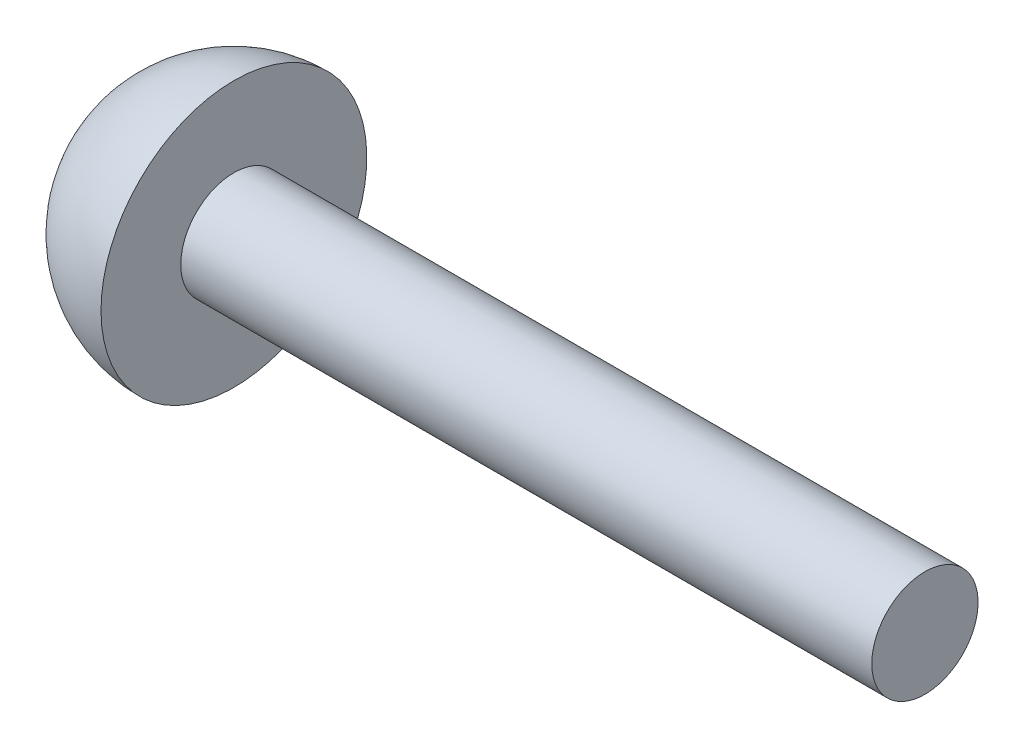
ISO-10303-21;
HEADER;
FILE_DESCRIPTION(('STEP AP214'),'2;1');
FILE_NAME('part.step','',(''),(''),'','','');
FILE_SCHEMA(('AUTOMOTIVE_DESIGN { 1 0 10303 214 1 1 1 1 }'));
ENDSEC;
DATA;
#1=APPLICATION_CONTEXT('core data for automotive mechanical design processes');
#2=APPLICATION_PROTOCOL_DEFINITION('international standard','automotive_design',2000,#1);
#3=PRODUCT_CONTEXT('',#1,'mechanical');
#4=PRODUCT('Part','Part','',(#3));
#5=PRODUCT_RELATED_PRODUCT_CATEGORY('part','',(#4));
#6=PRODUCT_DEFINITION_FORMATION('','',#4);
#7=PRODUCT_DEFINITION_CONTEXT('part definition',#1,'design');
#8=PRODUCT_DEFINITION('design','',#6,#7);
#9=PRODUCT_DEFINITION_SHAPE('','',#8);
#10=(LENGTH_UNIT() NAMED_UNIT(*) SI_UNIT(.MILLI.,.METRE.));
#11=(NAMED_UNIT(*) PLANE_ANGLE_UNIT() SI_UNIT($,.RADIAN.));
#12=(NAMED_UNIT(*) SI_UNIT($,.STERADIAN.) SOLID_ANGLE_UNIT());
#13=UNCERTAINTY_MEASURE_WITH_UNIT(LENGTH_MEASURE(1.E-05),#10,'distance_accuracy_value','');
#14=(GEOMETRIC_REPRESENTATION_CONTEXT(3) GLOBAL_UNCERTAINTY_ASSIGNED_CONTEXT((#13)) GLOBAL_UNIT_ASSIGNED_CONTEXT((#10,
#11,#12)) REPRESENTATION_CONTEXT('',''));
#15=CARTESIAN_POINT('',(0.,0.,0.));
#16=DIRECTION('',(0.,0.,1.));
#17=DIRECTION('',(1.,0.,0.));
#18=AXIS2_PLACEMENT_3D('',#15,#16,#17);
#19=CARTESIAN_POINT('',(0.,0.,0.));
#20=DIRECTION('',(-1.,0.,0.));
#21=DIRECTION('',(0.,0.,1.));
#22=AXIS2_PLACEMENT_3D('',#19,#20,#21);
#23=PLANE('',#22);
#24=CARTESIAN_POINT('',(0.,0.,0.));
#25=DIRECTION('',(-1.,0.,0.));
#26=DIRECTION('',(0.,0.,1.));
#27=AXIS2_PLACEMENT_3D('',#24,#25,#26);
#28=CIRCLE('',#27,2.);
#29=CARTESIAN_POINT('',(0.,0.,2.));
#30=VERTEX_POINT('',#29);
#31=EDGE_CURVE('E10',#30,#30,#28,.T.);
#32=ORIENTED_EDGE('',*,*,#31,.F.);
#33=EDGE_LOOP('',(#32));
#34=FACE_BOUND('',#33,.T.);
#35=ADVANCED_FACE('F34',(#34),#23,.F.);
#36=CARTESIAN_POINT('',(-31.,0.,0.));
#37=DIRECTION('',(-1.,0.,0.));
#38=DIRECTION('',(0.,0.,1.));
#39=AXIS2_PLACEMENT_3D('',#36,#37,#38);
#40=CYLINDRICAL_SURFACE('',#39,2.);
#41=CARTESIAN_POINT('',(-26.,0.,0.));
#42=DIRECTION('',(-1.,0.,0.));
#43=DIRECTION('',(0.,0.,1.));
#44=AXIS2_PLACEMENT_3D('',#41,#42,#43);
#45=CIRCLE('',#44,2.);
#46=CARTESIAN_POINT('',(-26.,0.,1.99999999999999));
#47=VERTEX_POINT('',#46);
#48=EDGE_CURVE('E41',#47,#47,#45,.T.);
#49=ORIENTED_EDGE('',*,*,#48,.F.);
#50=EDGE_LOOP('',(#49));
#51=FACE_BOUND('',#50,.T.);
#52=ORIENTED_EDGE('',*,*,#31,.T.);
#53=EDGE_LOOP('',(#52));
#54=FACE_BOUND('',#53,.T.);
#55=ADVANCED_FACE('F61',(#51,#54),#40,.T.);
#56=CARTESIAN_POINT('',(-26.,2.00000000000006,0.));
#57=DIRECTION('',(-1.,0.,0.));
#58=DIRECTION('',(0.,0.,1.));
#59=AXIS2_PLACEMENT_3D('',#56,#57,#58);
#60=PLANE('',#59);
#61=CARTESIAN_POINT('',(-26.,0.,0.));
#62=DIRECTION('',(-1.,0.,0.));
#63=DIRECTION('',(0.,0.,1.));
#64=AXIS2_PLACEMENT_3D('',#61,#62,#63);
#65=CIRCLE('',#64,5.);
#66=CARTESIAN_POINT('',(-26.,0.,4.99999999999999));
#67=VERTEX_POINT('',#66);
#68=EDGE_CURVE('E47',#67,#67,#65,.T.);
#69=ORIENTED_EDGE('',*,*,#68,.F.);
#70=EDGE_LOOP('',(#69));
#71=FACE_BOUND('',#70,.T.);
#72=ORIENTED_EDGE('',*,*,#48,.T.);
#73=EDGE_LOOP('',(#72));
#74=FACE_BOUND('',#73,.T.);
#75=ADVANCED_FACE('F59',(#71,#74),#60,.F.);
#76=CARTESIAN_POINT('',(-26.,0.,0.));
#77=DIRECTION('',(-1.,0.,0.));
#78=DIRECTION('',(0.,1.,0.));
#79=AXIS2_PLACEMENT_3D('',#76,#77,#78);
#80=SPHERICAL_SURFACE('',#79,5.);
#81=ORIENTED_EDGE('',*,*,#68,.T.);
#82=EDGE_LOOP('',(#81));
#83=FACE_BOUND('',#82,.T.);
#84=ADVANCED_FACE('F57',(#83),#80,.T.);
#85=CLOSED_SHELL('',(#35,#55,#75,#84));
#86=MANIFOLD_SOLID_BREP('B2',#85);
#87=ADVANCED_BREP_SHAPE_REPRESENTATION('',(#18,#86),#14);
#88=SHAPE_DEFINITION_REPRESENTATION(#9,#87);
ENDSEC;
END-ISO-10303-21;
